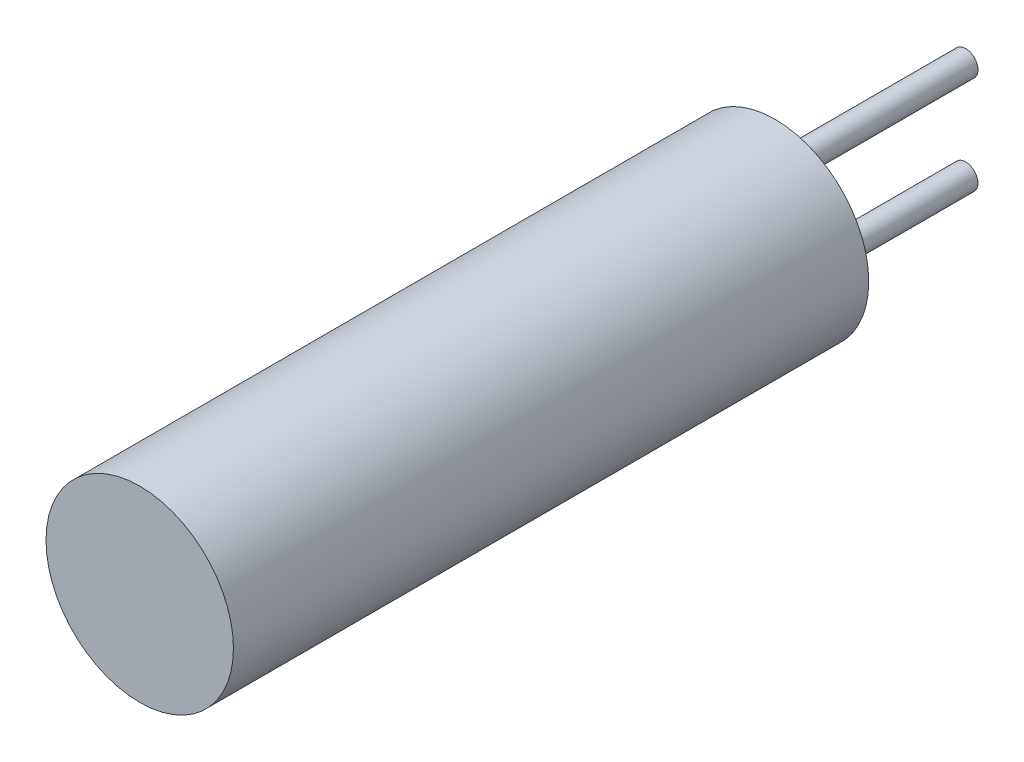
ISO-10303-21;
HEADER;
FILE_DESCRIPTION(('STEP AP214'),'2;1');
FILE_NAME('part.step','',(''),(''),'','','');
FILE_SCHEMA(('AUTOMOTIVE_DESIGN { 1 0 10303 214 1 1 1 1 }'));
ENDSEC;
DATA;
#1=APPLICATION_CONTEXT('core data for automotive mechanical design processes');
#2=APPLICATION_PROTOCOL_DEFINITION('international standard','automotive_design',2000,#1);
#3=PRODUCT_CONTEXT('',#1,'mechanical');
#4=PRODUCT('Part','Part','',(#3));
#5=PRODUCT_RELATED_PRODUCT_CATEGORY('part','',(#4));
#6=PRODUCT_DEFINITION_FORMATION('','',#4);
#7=PRODUCT_DEFINITION_CONTEXT('part definition',#1,'design');
#8=PRODUCT_DEFINITION('design','',#6,#7);
#9=PRODUCT_DEFINITION_SHAPE('','',#8);
#10=(LENGTH_UNIT() NAMED_UNIT(*) SI_UNIT(.MILLI.,.METRE.));
#11=(NAMED_UNIT(*) PLANE_ANGLE_UNIT() SI_UNIT($,.RADIAN.));
#12=(NAMED_UNIT(*) SI_UNIT($,.STERADIAN.) SOLID_ANGLE_UNIT());
#13=UNCERTAINTY_MEASURE_WITH_UNIT(LENGTH_MEASURE(1.E-05),#10,'distance_accuracy_value','');
#14=(GEOMETRIC_REPRESENTATION_CONTEXT(3) GLOBAL_UNCERTAINTY_ASSIGNED_CONTEXT((#13)) GLOBAL_UNIT_ASSIGNED_CONTEXT((#10,
#11,#12)) REPRESENTATION_CONTEXT('',''));
#15=CARTESIAN_POINT('',(0.,0.,0.));
#16=DIRECTION('',(0.,0.,1.));
#17=DIRECTION('',(1.,0.,0.));
#18=AXIS2_PLACEMENT_3D('',#15,#16,#17);
#19=CARTESIAN_POINT('',(0.,0.,20.));
#20=DIRECTION('',(0.,0.,-1.));
#21=DIRECTION('',(-1.,0.,0.));
#22=AXIS2_PLACEMENT_3D('',#19,#20,#21);
#23=CYLINDRICAL_SURFACE('',#22,2.95);
#24=CARTESIAN_POINT('',(0.,0.,20.));
#25=DIRECTION('',(0.,0.,1.));
#26=DIRECTION('',(1.,0.,0.));
#27=AXIS2_PLACEMENT_3D('',#24,#25,#26);
#28=CIRCLE('',#27,2.95);
#29=CARTESIAN_POINT('',(2.95,0.,20.));
#30=VERTEX_POINT('',#29);
#31=EDGE_CURVE('E11',#30,#30,#28,.T.);
#32=ORIENTED_EDGE('',*,*,#31,.F.);
#33=EDGE_LOOP('',(#32));
#34=FACE_BOUND('',#33,.T.);
#35=CARTESIAN_POINT('',(0.,0.,0.));
#36=DIRECTION('',(0.,0.,1.));
#37=DIRECTION('',(1.,0.,0.));
#38=AXIS2_PLACEMENT_3D('',#35,#36,#37);
#39=CIRCLE('',#38,2.95);
#40=CARTESIAN_POINT('',(2.95,0.,0.));
#41=VERTEX_POINT('',#40);
#42=EDGE_CURVE('E46',#41,#41,#39,.T.);
#43=ORIENTED_EDGE('',*,*,#42,.T.);
#44=EDGE_LOOP('',(#43));
#45=FACE_BOUND('',#44,.T.);
#46=ADVANCED_FACE('F43',(#34,#45),#23,.T.);
#47=CARTESIAN_POINT('',(0.,0.,20.));
#48=DIRECTION('',(0.,0.,1.));
#49=DIRECTION('',(1.,0.,0.));
#50=AXIS2_PLACEMENT_3D('',#47,#48,#49);
#51=PLANE('',#50);
#52=ORIENTED_EDGE('',*,*,#31,.T.);
#53=EDGE_LOOP('',(#52));
#54=FACE_BOUND('',#53,.T.);
#55=ADVANCED_FACE('F58',(#54),#51,.T.);
#56=CARTESIAN_POINT('',(0.,0.,0.));
#57=DIRECTION('',(0.,0.,1.));
#58=DIRECTION('',(1.,0.,0.));
#59=AXIS2_PLACEMENT_3D('',#56,#57,#58);
#60=PLANE('',#59);
#61=ORIENTED_EDGE('',*,*,#42,.F.);
#62=EDGE_LOOP('',(#61));
#63=FACE_BOUND('',#62,.T.);
#64=ADVANCED_FACE('F56',(#63),#60,.F.);
#65=CLOSED_SHELL('',(#46,#55,#64));
#66=MANIFOLD_SOLID_BREP('B2',#65);
#67=CARTESIAN_POINT('',(0.,-1.602262449517,-6.));
#68=DIRECTION('',(0.,0.,1.));
#69=DIRECTION('',(1.,0.,0.));
#70=AXIS2_PLACEMENT_3D('',#67,#68,#69);
#71=CYLINDRICAL_SURFACE('',#70,0.3898185985847);
#72=CARTESIAN_POINT('',(0.,-1.602262449517,-6.));
#73=DIRECTION('',(0.,0.,1.));
#74=DIRECTION('',(1.,0.,0.));
#75=AXIS2_PLACEMENT_3D('',#72,#73,#74);
#76=CIRCLE('',#75,0.3898185985847);
#77=CARTESIAN_POINT('',(0.3898185985847,-1.602262449517,-6.));
#78=VERTEX_POINT('',#77);
#79=EDGE_CURVE('E42',#78,#78,#76,.T.);
#80=ORIENTED_EDGE('',*,*,#79,.T.);
#81=EDGE_LOOP('',(#80));
#82=FACE_BOUND('',#81,.T.);
#83=CARTESIAN_POINT('',(0.,-1.602262449517,0.));
#84=DIRECTION('',(0.,0.,1.));
#85=DIRECTION('',(1.,0.,0.));
#86=AXIS2_PLACEMENT_3D('',#83,#84,#85);
#87=CIRCLE('',#86,0.3898185985847);
#88=CARTESIAN_POINT('',(0.3898185985847,-1.602262449517,0.));
#89=VERTEX_POINT('',#88);
#90=EDGE_CURVE('E93',#89,#89,#87,.T.);
#91=ORIENTED_EDGE('',*,*,#90,.F.);
#92=EDGE_LOOP('',(#91));
#93=FACE_BOUND('',#92,.T.);
#94=ADVANCED_FACE('F90',(#82,#93),#71,.T.);
#95=CARTESIAN_POINT('',(0.,-1.602262449517,-6.));
#96=DIRECTION('',(0.,0.,1.));
#97=DIRECTION('',(1.,0.,0.));
#98=AXIS2_PLACEMENT_3D('',#95,#96,#97);
#99=PLANE('',#98);
#100=ORIENTED_EDGE('',*,*,#79,.F.);
#101=EDGE_LOOP('',(#100));
#102=FACE_BOUND('',#101,.T.);
#103=ADVANCED_FACE('F105',(#102),#99,.F.);
#104=CARTESIAN_POINT('',(0.,-1.602262449517,0.));
#105=DIRECTION('',(0.,0.,1.));
#106=DIRECTION('',(1.,0.,0.));
#107=AXIS2_PLACEMENT_3D('',#104,#105,#106);
#108=PLANE('',#107);
#109=ORIENTED_EDGE('',*,*,#90,.T.);
#110=EDGE_LOOP('',(#109));
#111=FACE_BOUND('',#110,.T.);
#112=ADVANCED_FACE('F102',(#111),#108,.T.);
#113=CLOSED_SHELL('',(#94,#103,#112));
#114=MANIFOLD_SOLID_BREP('B6',#113);
#115=CARTESIAN_POINT('',(0.,1.489822979376,-6.));
#116=DIRECTION('',(0.,0.,1.));
#117=DIRECTION('',(1.,0.,0.));
#118=AXIS2_PLACEMENT_3D('',#115,#116,#117);
#119=CYLINDRICAL_SURFACE('',#118,0.3898185985847);
#120=CARTESIAN_POINT('',(0.,1.489822979376,-6.));
#121=DIRECTION('',(0.,0.,1.));
#122=DIRECTION('',(1.,0.,0.));
#123=AXIS2_PLACEMENT_3D('',#120,#121,#122);
#124=CIRCLE('',#123,0.3898185985847);
#125=CARTESIAN_POINT('',(0.3898185985847,1.489822979376,-6.));
#126=VERTEX_POINT('',#125);
#127=EDGE_CURVE('E89',#126,#126,#124,.T.);
#128=ORIENTED_EDGE('',*,*,#127,.T.);
#129=EDGE_LOOP('',(#128));
#130=FACE_BOUND('',#129,.T.);
#131=CARTESIAN_POINT('',(0.,1.489822979376,0.));
#132=DIRECTION('',(0.,0.,1.));
#133=DIRECTION('',(1.,0.,0.));
#134=AXIS2_PLACEMENT_3D('',#131,#132,#133);
#135=CIRCLE('',#134,0.3898185985847);
#136=CARTESIAN_POINT('',(0.3898185985847,1.489822979376,0.));
#137=VERTEX_POINT('',#136);
#138=EDGE_CURVE('E133',#137,#137,#135,.T.);
#139=ORIENTED_EDGE('',*,*,#138,.F.);
#140=EDGE_LOOP('',(#139));
#141=FACE_BOUND('',#140,.T.);
#142=ADVANCED_FACE('F130',(#130,#141),#119,.T.);
#143=CARTESIAN_POINT('',(0.,1.489822979376,-6.));
#144=DIRECTION('',(0.,0.,1.));
#145=DIRECTION('',(1.,0.,0.));
#146=AXIS2_PLACEMENT_3D('',#143,#144,#145);
#147=PLANE('',#146);
#148=ORIENTED_EDGE('',*,*,#127,.F.);
#149=EDGE_LOOP('',(#148));
#150=FACE_BOUND('',#149,.T.);
#151=ADVANCED_FACE('F145',(#150),#147,.F.);
#152=CARTESIAN_POINT('',(0.,1.489822979376,0.));
#153=DIRECTION('',(0.,0.,1.));
#154=DIRECTION('',(1.,0.,0.));
#155=AXIS2_PLACEMENT_3D('',#152,#153,#154);
#156=PLANE('',#155);
#157=ORIENTED_EDGE('',*,*,#138,.T.);
#158=EDGE_LOOP('',(#157));
#159=FACE_BOUND('',#158,.T.);
#160=ADVANCED_FACE('F142',(#159),#156,.T.);
#161=CLOSED_SHELL('',(#142,#151,#160));
#162=MANIFOLD_SOLID_BREP('B37',#161);
#163=ADVANCED_BREP_SHAPE_REPRESENTATION('',(#18,#66,#114,#162),#14);
#164=SHAPE_DEFINITION_REPRESENTATION(#9,#163);
ENDSEC;
END-ISO-10303-21;
